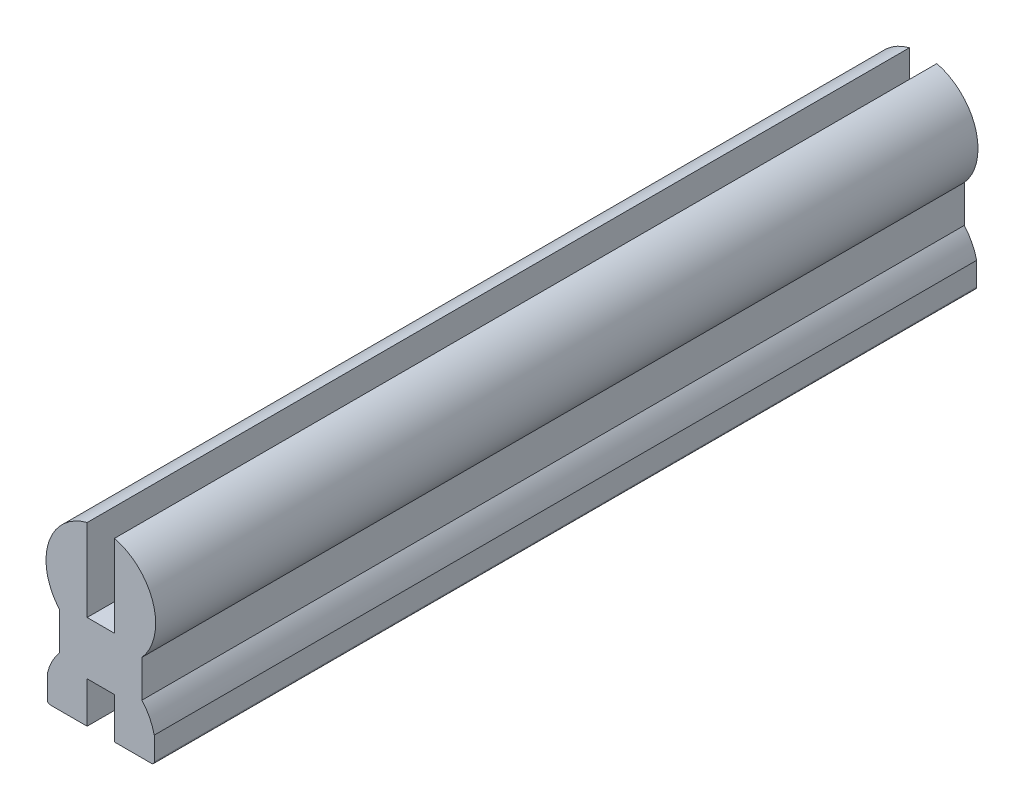
ISO-10303-21;
HEADER;
FILE_DESCRIPTION(('STEP AP214'),'2;1');
FILE_NAME('part.step','',(''),(''),'','','');
FILE_SCHEMA(('AUTOMOTIVE_DESIGN { 1 0 10303 214 1 1 1 1 }'));
ENDSEC;
DATA;
#1=APPLICATION_CONTEXT('core data for automotive mechanical design processes');
#2=APPLICATION_PROTOCOL_DEFINITION('international standard','automotive_design',2000,#1);
#3=PRODUCT_CONTEXT('',#1,'mechanical');
#4=PRODUCT('Part','Part','',(#3));
#5=PRODUCT_RELATED_PRODUCT_CATEGORY('part','',(#4));
#6=PRODUCT_DEFINITION_FORMATION('','',#4);
#7=PRODUCT_DEFINITION_CONTEXT('part definition',#1,'design');
#8=PRODUCT_DEFINITION('design','',#6,#7);
#9=PRODUCT_DEFINITION_SHAPE('','',#8);
#10=(LENGTH_UNIT() NAMED_UNIT(*) SI_UNIT(.MILLI.,.METRE.));
#11=(NAMED_UNIT(*) PLANE_ANGLE_UNIT() SI_UNIT($,.RADIAN.));
#12=(NAMED_UNIT(*) SI_UNIT($,.STERADIAN.) SOLID_ANGLE_UNIT());
#13=UNCERTAINTY_MEASURE_WITH_UNIT(LENGTH_MEASURE(1.E-05),#10,'distance_accuracy_value','');
#14=(GEOMETRIC_REPRESENTATION_CONTEXT(3) GLOBAL_UNCERTAINTY_ASSIGNED_CONTEXT((#13)) GLOBAL_UNIT_ASSIGNED_CONTEXT((#10,
#11,#12)) REPRESENTATION_CONTEXT('',''));
#15=CARTESIAN_POINT('',(0.,0.,0.));
#16=DIRECTION('',(0.,0.,1.));
#17=DIRECTION('',(1.,0.,0.));
#18=AXIS2_PLACEMENT_3D('',#15,#16,#17);
#19=CARTESIAN_POINT('',(0.,2.,-30.));
#20=DIRECTION('',(0.,0.,1.));
#21=DIRECTION('',(1.,0.,0.));
#22=AXIS2_PLACEMENT_3D('',#19,#20,#21);
#23=CYLINDRICAL_SURFACE('',#22,2.);
#24=CARTESIAN_POINT('',(0.,2.,0.));
#25=DIRECTION('',(0.,0.,1.));
#26=DIRECTION('',(1.,0.,0.));
#27=AXIS2_PLACEMENT_3D('',#24,#25,#26);
#28=CIRCLE('',#27,2.);
#29=CARTESIAN_POINT('',(1.5,0.677124344467703,0.));
#30=VERTEX_POINT('',#29);
#31=CARTESIAN_POINT('',(0.5,3.93649167310371,0.));
#32=VERTEX_POINT('',#31);
#33=EDGE_CURVE('E230',#30,#32,#28,.T.);
#34=ORIENTED_EDGE('',*,*,#33,.F.);
#35=DIRECTION('',(0.,0.,1.));
#36=VECTOR('',#35,1.);
#37=CARTESIAN_POINT('',(1.5,0.677124344467703,-30.));
#38=LINE('',#37,#36);
#39=CARTESIAN_POINT('',(1.5,0.677124344467703,-30.));
#40=VERTEX_POINT('',#39);
#41=EDGE_CURVE('E188',#40,#30,#38,.T.);
#42=ORIENTED_EDGE('',*,*,#41,.F.);
#43=CARTESIAN_POINT('',(0.,2.,-30.));
#44=DIRECTION('',(0.,0.,1.));
#45=DIRECTION('',(1.,0.,0.));
#46=AXIS2_PLACEMENT_3D('',#43,#44,#45);
#47=CIRCLE('',#46,2.);
#48=CARTESIAN_POINT('',(0.5,3.93649167310371,-30.));
#49=VERTEX_POINT('',#48);
#50=EDGE_CURVE('E182',#40,#49,#47,.T.);
#51=ORIENTED_EDGE('',*,*,#50,.T.);
#52=DIRECTION('',(0.,0.,1.));
#53=VECTOR('',#52,1.);
#54=CARTESIAN_POINT('',(0.5,3.93649167310371,-30.));
#55=LINE('',#54,#53);
#56=EDGE_CURVE('E164',#49,#32,#55,.T.);
#57=ORIENTED_EDGE('',*,*,#56,.T.);
#58=EDGE_LOOP('',(#34,#42,#51,#57));
#59=FACE_BOUND('',#58,.T.);
#60=ADVANCED_FACE('F39',(#59),#23,.T.);
#61=CARTESIAN_POINT('',(1.5,0.677124344467703,-30.));
#62=DIRECTION('',(1.,0.,0.));
#63=DIRECTION('',(0.,1.,0.));
#64=AXIS2_PLACEMENT_3D('',#61,#62,#63);
#65=PLANE('',#64);
#66=DIRECTION('',(0.,1.,0.));
#67=VECTOR('',#66,1.);
#68=CARTESIAN_POINT('',(1.5,0.677124344467703,0.));
#69=LINE('',#68,#67);
#70=CARTESIAN_POINT('',(1.5,-0.677124344467706,0.));
#71=VERTEX_POINT('',#70);
#72=EDGE_CURVE('E189',#71,#30,#69,.T.);
#73=ORIENTED_EDGE('',*,*,#72,.F.);
#74=DIRECTION('',(0.,0.,1.));
#75=VECTOR('',#74,1.);
#76=CARTESIAN_POINT('',(1.5,-0.677124344467706,-30.));
#77=LINE('',#76,#75);
#78=CARTESIAN_POINT('',(1.5,-0.677124344467706,-30.));
#79=VERTEX_POINT('',#78);
#80=EDGE_CURVE('E271',#79,#71,#77,.T.);
#81=ORIENTED_EDGE('',*,*,#80,.F.);
#82=DIRECTION('',(0.,1.,0.));
#83=VECTOR('',#82,1.);
#84=CARTESIAN_POINT('',(1.5,0.677124344467703,-30.));
#85=LINE('',#84,#83);
#86=EDGE_CURVE('E175',#79,#40,#85,.T.);
#87=ORIENTED_EDGE('',*,*,#86,.T.);
#88=ORIENTED_EDGE('',*,*,#41,.T.);
#89=EDGE_LOOP('',(#73,#81,#87,#88));
#90=FACE_BOUND('',#89,.T.);
#91=ADVANCED_FACE('F359',(#90),#65,.T.);
#92=CARTESIAN_POINT('',(0.,-2.,-30.));
#93=DIRECTION('',(0.,0.,1.));
#94=DIRECTION('',(1.,0.,0.));
#95=AXIS2_PLACEMENT_3D('',#92,#93,#94);
#96=CYLINDRICAL_SURFACE('',#95,2.);
#97=CARTESIAN_POINT('',(0.,-2.,0.));
#98=DIRECTION('',(0.,0.,1.));
#99=DIRECTION('',(1.,0.,0.));
#100=AXIS2_PLACEMENT_3D('',#97,#98,#99);
#101=CIRCLE('',#100,2.);
#102=CARTESIAN_POINT('',(1.95,-1.55559027913422,0.));
#103=VERTEX_POINT('',#102);
#104=EDGE_CURVE('E192',#103,#71,#101,.T.);
#105=ORIENTED_EDGE('',*,*,#104,.F.);
#106=DIRECTION('',(0.,0.,1.));
#107=VECTOR('',#106,1.);
#108=CARTESIAN_POINT('',(1.95,-1.55559027913422,-30.));
#109=LINE('',#108,#107);
#110=CARTESIAN_POINT('',(1.95,-1.55559027913422,-30.));
#111=VERTEX_POINT('',#110);
#112=EDGE_CURVE('E273',#111,#103,#109,.T.);
#113=ORIENTED_EDGE('',*,*,#112,.F.);
#114=CARTESIAN_POINT('',(0.,-2.,-30.));
#115=DIRECTION('',(0.,0.,1.));
#116=DIRECTION('',(1.,0.,0.));
#117=AXIS2_PLACEMENT_3D('',#114,#115,#116);
#118=CIRCLE('',#117,2.);
#119=EDGE_CURVE('E226',#111,#79,#118,.T.);
#120=ORIENTED_EDGE('',*,*,#119,.T.);
#121=ORIENTED_EDGE('',*,*,#80,.T.);
#122=EDGE_LOOP('',(#105,#113,#120,#121));
#123=FACE_BOUND('',#122,.T.);
#124=ADVANCED_FACE('F363',(#123),#96,.T.);
#125=CARTESIAN_POINT('',(1.95,-2.5,-30.));
#126=DIRECTION('',(1.,0.,0.));
#127=DIRECTION('',(0.,0.,-1.));
#128=AXIS2_PLACEMENT_3D('',#125,#126,#127);
#129=PLANE('',#128);
#130=DIRECTION('',(0.,1.,0.));
#131=VECTOR('',#130,1.);
#132=CARTESIAN_POINT('',(1.95,-2.5,0.));
#133=LINE('',#132,#131);
#134=CARTESIAN_POINT('',(1.95,-2.4,0.));
#135=VERTEX_POINT('',#134);
#136=EDGE_CURVE('E265',#135,#103,#133,.T.);
#137=ORIENTED_EDGE('',*,*,#136,.F.);
#138=DIRECTION('',(0.,0.,1.));
#139=VECTOR('',#138,1.);
#140=CARTESIAN_POINT('',(1.95,-2.4,-30.));
#141=LINE('',#140,#139);
#142=CARTESIAN_POINT('',(1.95,-2.4,-30.));
#143=VERTEX_POINT('',#142);
#144=EDGE_CURVE('E11',#135,#143,#141,.F.);
#145=ORIENTED_EDGE('',*,*,#144,.T.);
#146=DIRECTION('',(0.,1.,0.));
#147=VECTOR('',#146,1.);
#148=CARTESIAN_POINT('',(1.95,-2.5,-30.));
#149=LINE('',#148,#147);
#150=EDGE_CURVE('E224',#143,#111,#149,.T.);
#151=ORIENTED_EDGE('',*,*,#150,.T.);
#152=ORIENTED_EDGE('',*,*,#112,.T.);
#153=EDGE_LOOP('',(#137,#145,#151,#152));
#154=FACE_BOUND('',#153,.T.);
#155=ADVANCED_FACE('F364',(#154),#129,.T.);
#156=CARTESIAN_POINT('',(0.500000000000001,-2.5,-30.));
#157=DIRECTION('',(0.,-1.,0.));
#158=DIRECTION('',(1.,0.,0.));
#159=AXIS2_PLACEMENT_3D('',#156,#157,#158);
#160=PLANE('',#159);
#161=DIRECTION('',(1.,0.,0.));
#162=VECTOR('',#161,1.);
#163=CARTESIAN_POINT('',(0.500000000000001,-2.5,-30.));
#164=LINE('',#163,#162);
#165=CARTESIAN_POINT('',(0.500000000000001,-2.5,-30.));
#166=VERTEX_POINT('',#165);
#167=CARTESIAN_POINT('',(1.85,-2.5,-30.));
#168=VERTEX_POINT('',#167);
#169=EDGE_CURVE('E222',#166,#168,#164,.T.);
#170=ORIENTED_EDGE('',*,*,#169,.T.);
#171=DIRECTION('',(0.,0.,1.));
#172=VECTOR('',#171,1.);
#173=CARTESIAN_POINT('',(1.85,-2.5,-30.));
#174=LINE('',#173,#172);
#175=CARTESIAN_POINT('',(1.85,-2.5,0.));
#176=VERTEX_POINT('',#175);
#177=EDGE_CURVE('E47',#168,#176,#174,.T.);
#178=ORIENTED_EDGE('',*,*,#177,.T.);
#179=DIRECTION('',(1.,0.,0.));
#180=VECTOR('',#179,1.);
#181=CARTESIAN_POINT('',(0.500000000000001,-2.5,0.));
#182=LINE('',#181,#180);
#183=CARTESIAN_POINT('',(0.500000000000001,-2.5,0.));
#184=VERTEX_POINT('',#183);
#185=EDGE_CURVE('E262',#184,#176,#182,.T.);
#186=ORIENTED_EDGE('',*,*,#185,.F.);
#187=DIRECTION('',(0.,0.,1.));
#188=VECTOR('',#187,1.);
#189=CARTESIAN_POINT('',(0.500000000000001,-2.5,-30.));
#190=LINE('',#189,#188);
#191=EDGE_CURVE('E276',#166,#184,#190,.T.);
#192=ORIENTED_EDGE('',*,*,#191,.F.);
#193=EDGE_LOOP('',(#170,#178,#186,#192));
#194=FACE_BOUND('',#193,.T.);
#195=ADVANCED_FACE('F310',(#194),#160,.T.);
#196=CARTESIAN_POINT('',(0.5,-1.,-30.));
#197=DIRECTION('',(-1.,0.,0.));
#198=DIRECTION('',(0.,-1.,0.));
#199=AXIS2_PLACEMENT_3D('',#196,#197,#198);
#200=PLANE('',#199);
#201=DIRECTION('',(0.,-1.,0.));
#202=VECTOR('',#201,1.);
#203=CARTESIAN_POINT('',(0.5,-1.,0.));
#204=LINE('',#203,#202);
#205=CARTESIAN_POINT('',(0.5,-1.,0.));
#206=VERTEX_POINT('',#205);
#207=EDGE_CURVE('E259',#206,#184,#204,.T.);
#208=ORIENTED_EDGE('',*,*,#207,.F.);
#209=DIRECTION('',(0.,0.,1.));
#210=VECTOR('',#209,1.);
#211=CARTESIAN_POINT('',(0.5,-1.,-30.));
#212=LINE('',#211,#210);
#213=CARTESIAN_POINT('',(0.5,-1.,-30.));
#214=VERTEX_POINT('',#213);
#215=EDGE_CURVE('E278',#214,#206,#212,.T.);
#216=ORIENTED_EDGE('',*,*,#215,.F.);
#217=DIRECTION('',(0.,-1.,0.));
#218=VECTOR('',#217,1.);
#219=CARTESIAN_POINT('',(0.5,-1.,-30.));
#220=LINE('',#219,#218);
#221=EDGE_CURVE('E219',#214,#166,#220,.T.);
#222=ORIENTED_EDGE('',*,*,#221,.T.);
#223=ORIENTED_EDGE('',*,*,#191,.T.);
#224=EDGE_LOOP('',(#208,#216,#222,#223));
#225=FACE_BOUND('',#224,.T.);
#226=ADVANCED_FACE('F317',(#225),#200,.T.);
#227=CARTESIAN_POINT('',(-0.5,-1.,-30.));
#228=DIRECTION('',(0.,-1.,0.));
#229=DIRECTION('',(0.,0.,-1.));
#230=AXIS2_PLACEMENT_3D('',#227,#228,#229);
#231=PLANE('',#230);
#232=DIRECTION('',(1.,0.,0.));
#233=VECTOR('',#232,1.);
#234=CARTESIAN_POINT('',(-0.5,-1.,0.));
#235=LINE('',#234,#233);
#236=CARTESIAN_POINT('',(-0.5,-1.,0.));
#237=VERTEX_POINT('',#236);
#238=EDGE_CURVE('E256',#237,#206,#235,.T.);
#239=ORIENTED_EDGE('',*,*,#238,.F.);
#240=DIRECTION('',(0.,0.,1.));
#241=VECTOR('',#240,1.);
#242=CARTESIAN_POINT('',(-0.5,-1.,-30.));
#243=LINE('',#242,#241);
#244=CARTESIAN_POINT('',(-0.5,-1.,-30.));
#245=VERTEX_POINT('',#244);
#246=EDGE_CURVE('E280',#245,#237,#243,.T.);
#247=ORIENTED_EDGE('',*,*,#246,.F.);
#248=DIRECTION('',(1.,0.,0.));
#249=VECTOR('',#248,1.);
#250=CARTESIAN_POINT('',(-0.5,-1.,-30.));
#251=LINE('',#250,#249);
#252=EDGE_CURVE('E216',#245,#214,#251,.T.);
#253=ORIENTED_EDGE('',*,*,#252,.T.);
#254=ORIENTED_EDGE('',*,*,#215,.T.);
#255=EDGE_LOOP('',(#239,#247,#253,#254));
#256=FACE_BOUND('',#255,.T.);
#257=ADVANCED_FACE('F322',(#256),#231,.T.);
#258=CARTESIAN_POINT('',(-0.5,-1.,-30.));
#259=DIRECTION('',(1.,0.,0.));
#260=DIRECTION('',(0.,1.,0.));
#261=AXIS2_PLACEMENT_3D('',#258,#259,#260);
#262=PLANE('',#261);
#263=DIRECTION('',(0.,1.,0.));
#264=VECTOR('',#263,1.);
#265=CARTESIAN_POINT('',(-0.5,-1.,0.));
#266=LINE('',#265,#264);
#267=CARTESIAN_POINT('',(-0.5,-2.5,0.));
#268=VERTEX_POINT('',#267);
#269=EDGE_CURVE('E253',#268,#237,#266,.T.);
#270=ORIENTED_EDGE('',*,*,#269,.F.);
#271=DIRECTION('',(0.,0.,1.));
#272=VECTOR('',#271,1.);
#273=CARTESIAN_POINT('',(-0.5,-2.5,-30.));
#274=LINE('',#273,#272);
#275=CARTESIAN_POINT('',(-0.5,-2.5,-30.));
#276=VERTEX_POINT('',#275);
#277=EDGE_CURVE('E282',#276,#268,#274,.T.);
#278=ORIENTED_EDGE('',*,*,#277,.F.);
#279=DIRECTION('',(0.,1.,0.));
#280=VECTOR('',#279,1.);
#281=CARTESIAN_POINT('',(-0.5,-1.,-30.));
#282=LINE('',#281,#280);
#283=EDGE_CURVE('E213',#276,#245,#282,.T.);
#284=ORIENTED_EDGE('',*,*,#283,.T.);
#285=ORIENTED_EDGE('',*,*,#246,.T.);
#286=EDGE_LOOP('',(#270,#278,#284,#285));
#287=FACE_BOUND('',#286,.T.);
#288=ADVANCED_FACE('F325',(#287),#262,.T.);
#289=CARTESIAN_POINT('',(-1.95,-2.5,-30.));
#290=DIRECTION('',(0.,-1.,0.));
#291=DIRECTION('',(1.,0.,0.));
#292=AXIS2_PLACEMENT_3D('',#289,#290,#291);
#293=PLANE('',#292);
#294=DIRECTION('',(1.,0.,0.));
#295=VECTOR('',#294,1.);
#296=CARTESIAN_POINT('',(-1.95,-2.5,0.));
#297=LINE('',#296,#295);
#298=CARTESIAN_POINT('',(-1.85,-2.5,0.));
#299=VERTEX_POINT('',#298);
#300=EDGE_CURVE('E251',#299,#268,#297,.T.);
#301=ORIENTED_EDGE('',*,*,#300,.F.);
#302=DIRECTION('',(0.,0.,1.));
#303=VECTOR('',#302,1.);
#304=CARTESIAN_POINT('',(-1.85,-2.5,-30.));
#305=LINE('',#304,#303);
#306=CARTESIAN_POINT('',(-1.85,-2.5,-30.));
#307=VERTEX_POINT('',#306);
#308=EDGE_CURVE('E302',#299,#307,#305,.F.);
#309=ORIENTED_EDGE('',*,*,#308,.T.);
#310=DIRECTION('',(1.,0.,0.));
#311=VECTOR('',#310,1.);
#312=CARTESIAN_POINT('',(-1.95,-2.5,-30.));
#313=LINE('',#312,#311);
#314=EDGE_CURVE('E211',#307,#276,#313,.T.);
#315=ORIENTED_EDGE('',*,*,#314,.T.);
#316=ORIENTED_EDGE('',*,*,#277,.T.);
#317=EDGE_LOOP('',(#301,#309,#315,#316));
#318=FACE_BOUND('',#317,.T.);
#319=ADVANCED_FACE('F390',(#318),#293,.T.);
#320=CARTESIAN_POINT('',(-1.95,-2.5,-30.));
#321=DIRECTION('',(-1.,0.,0.));
#322=DIRECTION('',(0.,0.,1.));
#323=AXIS2_PLACEMENT_3D('',#320,#321,#322);
#324=PLANE('',#323);
#325=DIRECTION('',(0.,-1.,0.));
#326=VECTOR('',#325,1.);
#327=CARTESIAN_POINT('',(-1.95,-2.5,-30.));
#328=LINE('',#327,#326);
#329=CARTESIAN_POINT('',(-1.95,-1.55559027913422,-30.));
#330=VERTEX_POINT('',#329);
#331=CARTESIAN_POINT('',(-1.95,-2.4,-30.));
#332=VERTEX_POINT('',#331);
#333=EDGE_CURVE('E208',#330,#332,#328,.T.);
#334=ORIENTED_EDGE('',*,*,#333,.T.);
#335=DIRECTION('',(0.,0.,1.));
#336=VECTOR('',#335,1.);
#337=CARTESIAN_POINT('',(-1.95,-2.4,-30.));
#338=LINE('',#337,#336);
#339=CARTESIAN_POINT('',(-1.95,-2.4,0.));
#340=VERTEX_POINT('',#339);
#341=EDGE_CURVE('E270',#332,#340,#338,.T.);
#342=ORIENTED_EDGE('',*,*,#341,.T.);
#343=DIRECTION('',(0.,-1.,0.));
#344=VECTOR('',#343,1.);
#345=CARTESIAN_POINT('',(-1.95,-2.5,0.));
#346=LINE('',#345,#344);
#347=CARTESIAN_POINT('',(-1.95,-1.55559027913422,0.));
#348=VERTEX_POINT('',#347);
#349=EDGE_CURVE('E248',#348,#340,#346,.T.);
#350=ORIENTED_EDGE('',*,*,#349,.F.);
#351=DIRECTION('',(0.,0.,1.));
#352=VECTOR('',#351,1.);
#353=CARTESIAN_POINT('',(-1.95,-1.55559027913422,-30.));
#354=LINE('',#353,#352);
#355=EDGE_CURVE('E285',#330,#348,#354,.T.);
#356=ORIENTED_EDGE('',*,*,#355,.F.);
#357=EDGE_LOOP('',(#334,#342,#350,#356));
#358=FACE_BOUND('',#357,.T.);
#359=ADVANCED_FACE('F336',(#358),#324,.T.);
#360=CARTESIAN_POINT('',(0.,-2.,-30.));
#361=DIRECTION('',(0.,0.,1.));
#362=DIRECTION('',(1.,0.,0.));
#363=AXIS2_PLACEMENT_3D('',#360,#361,#362);
#364=CYLINDRICAL_SURFACE('',#363,2.);
#365=CARTESIAN_POINT('',(0.,-2.,0.));
#366=DIRECTION('',(0.,0.,1.));
#367=DIRECTION('',(1.,0.,0.));
#368=AXIS2_PLACEMENT_3D('',#365,#366,#367);
#369=CIRCLE('',#368,2.);
#370=CARTESIAN_POINT('',(-1.5,-0.677124344467706,0.));
#371=VERTEX_POINT('',#370);
#372=EDGE_CURVE('E245',#371,#348,#369,.T.);
#373=ORIENTED_EDGE('',*,*,#372,.F.);
#374=DIRECTION('',(0.,0.,1.));
#375=VECTOR('',#374,1.);
#376=CARTESIAN_POINT('',(-1.5,-0.677124344467706,-30.));
#377=LINE('',#376,#375);
#378=CARTESIAN_POINT('',(-1.5,-0.677124344467706,-30.));
#379=VERTEX_POINT('',#378);
#380=EDGE_CURVE('E287',#379,#371,#377,.T.);
#381=ORIENTED_EDGE('',*,*,#380,.F.);
#382=CARTESIAN_POINT('',(0.,-2.,-30.));
#383=DIRECTION('',(0.,0.,1.));
#384=DIRECTION('',(1.,0.,0.));
#385=AXIS2_PLACEMENT_3D('',#382,#383,#384);
#386=CIRCLE('',#385,2.);
#387=EDGE_CURVE('E205',#379,#330,#386,.T.);
#388=ORIENTED_EDGE('',*,*,#387,.T.);
#389=ORIENTED_EDGE('',*,*,#355,.T.);
#390=EDGE_LOOP('',(#373,#381,#388,#389));
#391=FACE_BOUND('',#390,.T.);
#392=ADVANCED_FACE('F341',(#391),#364,.T.);
#393=CARTESIAN_POINT('',(-1.5,0.677124344467706,-30.));
#394=DIRECTION('',(-1.,0.,0.));
#395=DIRECTION('',(0.,0.,1.));
#396=AXIS2_PLACEMENT_3D('',#393,#394,#395);
#397=PLANE('',#396);
#398=DIRECTION('',(0.,-1.,0.));
#399=VECTOR('',#398,1.);
#400=CARTESIAN_POINT('',(-1.5,0.677124344467706,0.));
#401=LINE('',#400,#399);
#402=CARTESIAN_POINT('',(-1.5,0.677124344467706,0.));
#403=VERTEX_POINT('',#402);
#404=EDGE_CURVE('E242',#403,#371,#401,.T.);
#405=ORIENTED_EDGE('',*,*,#404,.F.);
#406=DIRECTION('',(0.,0.,1.));
#407=VECTOR('',#406,1.);
#408=CARTESIAN_POINT('',(-1.5,0.677124344467706,-30.));
#409=LINE('',#408,#407);
#410=CARTESIAN_POINT('',(-1.5,0.677124344467706,-30.));
#411=VERTEX_POINT('',#410);
#412=EDGE_CURVE('E289',#411,#403,#409,.T.);
#413=ORIENTED_EDGE('',*,*,#412,.F.);
#414=DIRECTION('',(0.,-1.,0.));
#415=VECTOR('',#414,1.);
#416=CARTESIAN_POINT('',(-1.5,0.677124344467706,-30.));
#417=LINE('',#416,#415);
#418=EDGE_CURVE('E202',#411,#379,#417,.T.);
#419=ORIENTED_EDGE('',*,*,#418,.T.);
#420=ORIENTED_EDGE('',*,*,#380,.T.);
#421=EDGE_LOOP('',(#405,#413,#419,#420));
#422=FACE_BOUND('',#421,.T.);
#423=ADVANCED_FACE('F346',(#422),#397,.T.);
#424=CARTESIAN_POINT('',(0.,2.,-30.));
#425=DIRECTION('',(0.,0.,1.));
#426=DIRECTION('',(1.,0.,0.));
#427=AXIS2_PLACEMENT_3D('',#424,#425,#426);
#428=CYLINDRICAL_SURFACE('',#427,2.);
#429=CARTESIAN_POINT('',(0.,2.,0.));
#430=DIRECTION('',(0.,0.,1.));
#431=DIRECTION('',(1.,0.,0.));
#432=AXIS2_PLACEMENT_3D('',#429,#430,#431);
#433=CIRCLE('',#432,2.);
#434=CARTESIAN_POINT('',(-0.500000000000001,3.93649167310371,0.));
#435=VERTEX_POINT('',#434);
#436=EDGE_CURVE('E239',#435,#403,#433,.T.);
#437=ORIENTED_EDGE('',*,*,#436,.F.);
#438=DIRECTION('',(0.,0.,1.));
#439=VECTOR('',#438,1.);
#440=CARTESIAN_POINT('',(-0.500000000000001,3.93649167310371,-30.));
#441=LINE('',#440,#439);
#442=CARTESIAN_POINT('',(-0.500000000000001,3.93649167310371,-30.));
#443=VERTEX_POINT('',#442);
#444=EDGE_CURVE('E291',#443,#435,#441,.T.);
#445=ORIENTED_EDGE('',*,*,#444,.F.);
#446=CARTESIAN_POINT('',(0.,2.,-30.));
#447=DIRECTION('',(0.,0.,1.));
#448=DIRECTION('',(1.,0.,0.));
#449=AXIS2_PLACEMENT_3D('',#446,#447,#448);
#450=CIRCLE('',#449,2.);
#451=EDGE_CURVE('E199',#443,#411,#450,.T.);
#452=ORIENTED_EDGE('',*,*,#451,.T.);
#453=ORIENTED_EDGE('',*,*,#412,.T.);
#454=EDGE_LOOP('',(#437,#445,#452,#453));
#455=FACE_BOUND('',#454,.T.);
#456=ADVANCED_FACE('F349',(#455),#428,.T.);
#457=CARTESIAN_POINT('',(-0.500000000000001,3.93649167310371,-30.));
#458=DIRECTION('',(1.,0.,0.));
#459=DIRECTION('',(0.,1.,0.));
#460=AXIS2_PLACEMENT_3D('',#457,#458,#459);
#461=PLANE('',#460);
#462=DIRECTION('',(0.,1.,0.));
#463=VECTOR('',#462,1.);
#464=CARTESIAN_POINT('',(-0.500000000000001,3.93649167310371,0.));
#465=LINE('',#464,#463);
#466=CARTESIAN_POINT('',(-0.5,0.936491673103708,0.));
#467=VERTEX_POINT('',#466);
#468=EDGE_CURVE('E236',#467,#435,#465,.T.);
#469=ORIENTED_EDGE('',*,*,#468,.F.);
#470=DIRECTION('',(0.,0.,1.));
#471=VECTOR('',#470,1.);
#472=CARTESIAN_POINT('',(-0.5,0.936491673103708,-30.));
#473=LINE('',#472,#471);
#474=CARTESIAN_POINT('',(-0.5,0.936491673103708,-30.));
#475=VERTEX_POINT('',#474);
#476=EDGE_CURVE('E293',#475,#467,#473,.T.);
#477=ORIENTED_EDGE('',*,*,#476,.F.);
#478=DIRECTION('',(0.,1.,0.));
#479=VECTOR('',#478,1.);
#480=CARTESIAN_POINT('',(-0.500000000000001,3.93649167310371,-30.));
#481=LINE('',#480,#479);
#482=EDGE_CURVE('E196',#475,#443,#481,.T.);
#483=ORIENTED_EDGE('',*,*,#482,.T.);
#484=ORIENTED_EDGE('',*,*,#444,.T.);
#485=EDGE_LOOP('',(#469,#477,#483,#484));
#486=FACE_BOUND('',#485,.T.);
#487=ADVANCED_FACE('F352',(#486),#461,.T.);
#488=CARTESIAN_POINT('',(-0.5,0.936491673103708,-30.));
#489=DIRECTION('',(0.,1.,0.));
#490=DIRECTION('',(0.,0.,1.));
#491=AXIS2_PLACEMENT_3D('',#488,#489,#490);
#492=PLANE('',#491);
#493=DIRECTION('',(-1.,0.,0.));
#494=VECTOR('',#493,1.);
#495=CARTESIAN_POINT('',(-0.5,0.936491673103708,0.));
#496=LINE('',#495,#494);
#497=CARTESIAN_POINT('',(0.5,0.936491673103708,0.));
#498=VERTEX_POINT('',#497);
#499=EDGE_CURVE('E233',#498,#467,#496,.T.);
#500=ORIENTED_EDGE('',*,*,#499,.F.);
#501=DIRECTION('',(0.,0.,1.));
#502=VECTOR('',#501,1.);
#503=CARTESIAN_POINT('',(0.5,0.936491673103708,-30.));
#504=LINE('',#503,#502);
#505=CARTESIAN_POINT('',(0.5,0.936491673103708,-30.));
#506=VERTEX_POINT('',#505);
#507=EDGE_CURVE('E174',#506,#498,#504,.T.);
#508=ORIENTED_EDGE('',*,*,#507,.F.);
#509=DIRECTION('',(-1.,0.,0.));
#510=VECTOR('',#509,1.);
#511=CARTESIAN_POINT('',(-0.5,0.936491673103708,-30.));
#512=LINE('',#511,#510);
#513=EDGE_CURVE('E186',#506,#475,#512,.T.);
#514=ORIENTED_EDGE('',*,*,#513,.T.);
#515=ORIENTED_EDGE('',*,*,#476,.T.);
#516=EDGE_LOOP('',(#500,#508,#514,#515));
#517=FACE_BOUND('',#516,.T.);
#518=ADVANCED_FACE('F355',(#517),#492,.T.);
#519=CARTESIAN_POINT('',(0.5,0.936491673103708,-30.));
#520=DIRECTION('',(-1.,0.,0.));
#521=DIRECTION('',(0.,0.,1.));
#522=AXIS2_PLACEMENT_3D('',#519,#520,#521);
#523=PLANE('',#522);
#524=DIRECTION('',(0.,-1.,0.));
#525=VECTOR('',#524,1.);
#526=CARTESIAN_POINT('',(0.5,0.936491673103708,0.));
#527=LINE('',#526,#525);
#528=EDGE_CURVE('E169',#32,#498,#527,.T.);
#529=ORIENTED_EDGE('',*,*,#528,.F.);
#530=ORIENTED_EDGE('',*,*,#56,.F.);
#531=DIRECTION('',(0.,-1.,0.));
#532=VECTOR('',#531,1.);
#533=CARTESIAN_POINT('',(0.5,0.936491673103708,-30.));
#534=LINE('',#533,#532);
#535=EDGE_CURVE('E167',#49,#506,#534,.T.);
#536=ORIENTED_EDGE('',*,*,#535,.T.);
#537=ORIENTED_EDGE('',*,*,#507,.T.);
#538=EDGE_LOOP('',(#529,#530,#536,#537));
#539=FACE_BOUND('',#538,.T.);
#540=ADVANCED_FACE('F166',(#539),#523,.T.);
#541=CARTESIAN_POINT('',(0.,2.,-30.));
#542=DIRECTION('',(0.,0.,1.));
#543=DIRECTION('',(1.,0.,0.));
#544=AXIS2_PLACEMENT_3D('',#541,#542,#543);
#545=PLANE('',#544);
#546=ORIENTED_EDGE('',*,*,#314,.F.);
#547=CARTESIAN_POINT('',(-1.85,-2.4,-30.));
#548=DIRECTION('',(0.,0.,1.));
#549=DIRECTION('',(1.,0.,0.));
#550=AXIS2_PLACEMENT_3D('',#547,#548,#549);
#551=CIRCLE('',#550,0.1);
#552=EDGE_CURVE('E305',#307,#332,#551,.F.);
#553=ORIENTED_EDGE('',*,*,#552,.T.);
#554=ORIENTED_EDGE('',*,*,#333,.F.);
#555=ORIENTED_EDGE('',*,*,#387,.F.);
#556=ORIENTED_EDGE('',*,*,#418,.F.);
#557=ORIENTED_EDGE('',*,*,#451,.F.);
#558=ORIENTED_EDGE('',*,*,#482,.F.);
#559=ORIENTED_EDGE('',*,*,#513,.F.);
#560=ORIENTED_EDGE('',*,*,#535,.F.);
#561=ORIENTED_EDGE('',*,*,#50,.F.);
#562=ORIENTED_EDGE('',*,*,#86,.F.);
#563=ORIENTED_EDGE('',*,*,#119,.F.);
#564=ORIENTED_EDGE('',*,*,#150,.F.);
#565=CARTESIAN_POINT('',(1.85,-2.4,-30.));
#566=DIRECTION('',(0.,0.,1.));
#567=DIRECTION('',(1.,0.,0.));
#568=AXIS2_PLACEMENT_3D('',#565,#566,#567);
#569=CIRCLE('',#568,0.1);
#570=EDGE_CURVE('E54',#143,#168,#569,.F.);
#571=ORIENTED_EDGE('',*,*,#570,.T.);
#572=ORIENTED_EDGE('',*,*,#169,.F.);
#573=ORIENTED_EDGE('',*,*,#221,.F.);
#574=ORIENTED_EDGE('',*,*,#252,.F.);
#575=ORIENTED_EDGE('',*,*,#283,.F.);
#576=EDGE_LOOP('',(#546,#553,#554,#555,#556,#557,#558,#559,#560,#561,#562,#563,#564,#571,#572,
#573,#574,#575));
#577=FACE_BOUND('',#576,.T.);
#578=ADVANCED_FACE('F180',(#577),#545,.F.);
#579=CARTESIAN_POINT('',(0.,2.,0.));
#580=DIRECTION('',(0.,0.,1.));
#581=DIRECTION('',(1.,0.,0.));
#582=AXIS2_PLACEMENT_3D('',#579,#580,#581);
#583=PLANE('',#582);
#584=ORIENTED_EDGE('',*,*,#349,.T.);
#585=CARTESIAN_POINT('',(-1.85,-2.4,0.));
#586=DIRECTION('',(0.,0.,1.));
#587=DIRECTION('',(1.,0.,0.));
#588=AXIS2_PLACEMENT_3D('',#585,#586,#587);
#589=CIRCLE('',#588,0.1);
#590=EDGE_CURVE('E300',#340,#299,#589,.T.);
#591=ORIENTED_EDGE('',*,*,#590,.T.);
#592=ORIENTED_EDGE('',*,*,#300,.T.);
#593=ORIENTED_EDGE('',*,*,#269,.T.);
#594=ORIENTED_EDGE('',*,*,#238,.T.);
#595=ORIENTED_EDGE('',*,*,#207,.T.);
#596=ORIENTED_EDGE('',*,*,#185,.T.);
#597=CARTESIAN_POINT('',(1.85,-2.4,0.));
#598=DIRECTION('',(0.,0.,1.));
#599=DIRECTION('',(1.,0.,0.));
#600=AXIS2_PLACEMENT_3D('',#597,#598,#599);
#601=CIRCLE('',#600,0.1);
#602=EDGE_CURVE('E298',#176,#135,#601,.T.);
#603=ORIENTED_EDGE('',*,*,#602,.T.);
#604=ORIENTED_EDGE('',*,*,#136,.T.);
#605=ORIENTED_EDGE('',*,*,#104,.T.);
#606=ORIENTED_EDGE('',*,*,#72,.T.);
#607=ORIENTED_EDGE('',*,*,#33,.T.);
#608=ORIENTED_EDGE('',*,*,#528,.T.);
#609=ORIENTED_EDGE('',*,*,#499,.T.);
#610=ORIENTED_EDGE('',*,*,#468,.T.);
#611=ORIENTED_EDGE('',*,*,#436,.T.);
#612=ORIENTED_EDGE('',*,*,#404,.T.);
#613=ORIENTED_EDGE('',*,*,#372,.T.);
#614=EDGE_LOOP('',(#584,#591,#592,#593,#594,#595,#596,#603,#604,#605,#606,#607,#608,#609,#610,
#611,#612,#613));
#615=FACE_BOUND('',#614,.T.);
#616=ADVANCED_FACE('F313',(#615),#583,.T.);
#617=CARTESIAN_POINT('',(-1.85,-2.4,-30.));
#618=DIRECTION('',(0.,0.,1.));
#619=DIRECTION('',(1.,0.,0.));
#620=AXIS2_PLACEMENT_3D('',#617,#618,#619);
#621=CYLINDRICAL_SURFACE('',#620,0.1);
#622=ORIENTED_EDGE('',*,*,#552,.F.);
#623=ORIENTED_EDGE('',*,*,#308,.F.);
#624=ORIENTED_EDGE('',*,*,#590,.F.);
#625=ORIENTED_EDGE('',*,*,#341,.F.);
#626=EDGE_LOOP('',(#622,#623,#624,#625));
#627=FACE_BOUND('',#626,.T.);
#628=ADVANCED_FACE('F333',(#627),#621,.T.);
#629=CARTESIAN_POINT('',(1.85,-2.4,-30.));
#630=DIRECTION('',(0.,0.,1.));
#631=DIRECTION('',(1.,0.,0.));
#632=AXIS2_PLACEMENT_3D('',#629,#630,#631);
#633=CYLINDRICAL_SURFACE('',#632,0.1);
#634=ORIENTED_EDGE('',*,*,#570,.F.);
#635=ORIENTED_EDGE('',*,*,#144,.F.);
#636=ORIENTED_EDGE('',*,*,#602,.F.);
#637=ORIENTED_EDGE('',*,*,#177,.F.);
#638=EDGE_LOOP('',(#634,#635,#636,#637));
#639=FACE_BOUND('',#638,.T.);
#640=ADVANCED_FACE('F41',(#639),#633,.T.);
#641=CLOSED_SHELL('',(#60,#91,#124,#155,#195,#226,#257,#288,#319,#359,#392,#423,#456,#487,#518,
#540,#578,#616,#628,#640));
#642=MANIFOLD_SOLID_BREP('B2',#641);
#643=ADVANCED_BREP_SHAPE_REPRESENTATION('',(#18,#642),#14);
#644=SHAPE_DEFINITION_REPRESENTATION(#9,#643);
ENDSEC;
END-ISO-10303-21;
